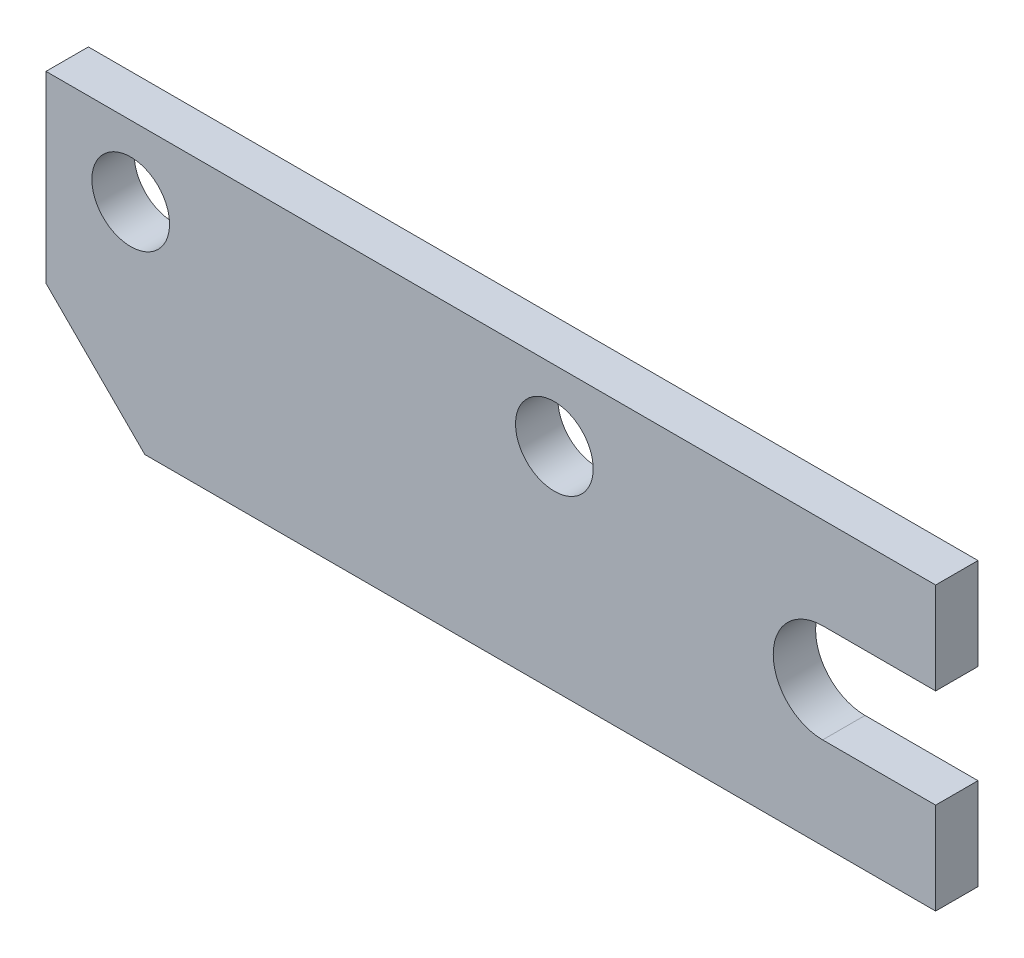
ISO-10303-21;
HEADER;
FILE_DESCRIPTION(('STEP AP214'),'2;1');
FILE_NAME('part.step','',(''),(''),'','','');
FILE_SCHEMA(('AUTOMOTIVE_DESIGN { 1 0 10303 214 1 1 1 1 }'));
ENDSEC;
DATA;
#1=APPLICATION_CONTEXT('core data for automotive mechanical design processes');
#2=APPLICATION_PROTOCOL_DEFINITION('international standard','automotive_design',2000,#1);
#3=PRODUCT_CONTEXT('',#1,'mechanical');
#4=PRODUCT('Part','Part','',(#3));
#5=PRODUCT_RELATED_PRODUCT_CATEGORY('part','',(#4));
#6=PRODUCT_DEFINITION_FORMATION('','',#4);
#7=PRODUCT_DEFINITION_CONTEXT('part definition',#1,'design');
#8=PRODUCT_DEFINITION('design','',#6,#7);
#9=PRODUCT_DEFINITION_SHAPE('','',#8);
#10=(LENGTH_UNIT() NAMED_UNIT(*) SI_UNIT(.MILLI.,.METRE.));
#11=(NAMED_UNIT(*) PLANE_ANGLE_UNIT() SI_UNIT($,.RADIAN.));
#12=(NAMED_UNIT(*) SI_UNIT($,.STERADIAN.) SOLID_ANGLE_UNIT());
#13=UNCERTAINTY_MEASURE_WITH_UNIT(LENGTH_MEASURE(1.E-05),#10,'distance_accuracy_value','');
#14=(GEOMETRIC_REPRESENTATION_CONTEXT(3) GLOBAL_UNCERTAINTY_ASSIGNED_CONTEXT((#13)) GLOBAL_UNIT_ASSIGNED_CONTEXT((#10,
#11,#12)) REPRESENTATION_CONTEXT('',''));
#15=CARTESIAN_POINT('',(0.,0.,0.));
#16=DIRECTION('',(0.,0.,1.));
#17=DIRECTION('',(1.,0.,0.));
#18=AXIS2_PLACEMENT_3D('',#15,#16,#17);
#19=CARTESIAN_POINT('',(31.5,-10.,3.));
#20=DIRECTION('',(-1.,0.,0.));
#21=DIRECTION('',(0.,0.,1.));
#22=AXIS2_PLACEMENT_3D('',#19,#20,#21);
#23=PLANE('',#22);
#24=DIRECTION('',(0.,1.,0.));
#25=VECTOR('',#24,1.);
#26=CARTESIAN_POINT('',(31.5,-10.,3.));
#27=LINE('',#26,#25);
#28=CARTESIAN_POINT('',(31.5,3.5,3.));
#29=VERTEX_POINT('',#28);
#30=CARTESIAN_POINT('',(31.5,10.,3.));
#31=VERTEX_POINT('',#30);
#32=EDGE_CURVE('E134',#29,#31,#27,.T.);
#33=ORIENTED_EDGE('',*,*,#32,.F.);
#34=DIRECTION('',(0.,0.,-1.));
#35=VECTOR('',#34,1.);
#36=CARTESIAN_POINT('',(31.5,3.5,3.));
#37=LINE('',#36,#35);
#38=CARTESIAN_POINT('',(31.5,3.5,0.));
#39=VERTEX_POINT('',#38);
#40=EDGE_CURVE('E181',#29,#39,#37,.T.);
#41=ORIENTED_EDGE('',*,*,#40,.T.);
#42=DIRECTION('',(0.,1.,0.));
#43=VECTOR('',#42,1.);
#44=CARTESIAN_POINT('',(31.5,-10.,0.));
#45=LINE('',#44,#43);
#46=CARTESIAN_POINT('',(31.5,10.,0.));
#47=VERTEX_POINT('',#46);
#48=EDGE_CURVE('E148',#39,#47,#45,.T.);
#49=ORIENTED_EDGE('',*,*,#48,.T.);
#50=DIRECTION('',(0.,0.,-1.));
#51=VECTOR('',#50,1.);
#52=CARTESIAN_POINT('',(31.5,10.,3.));
#53=LINE('',#52,#51);
#54=EDGE_CURVE('E157',#31,#47,#53,.T.);
#55=ORIENTED_EDGE('',*,*,#54,.F.);
#56=EDGE_LOOP('',(#33,#41,#49,#55));
#57=FACE_BOUND('',#56,.T.);
#58=ADVANCED_FACE('F35',(#57),#23,.F.);
#59=CARTESIAN_POINT('',(31.5,-10.,0.));
#60=VERTEX_POINT('',#59);
#61=CARTESIAN_POINT('',(31.5,-3.5,0.));
#62=VERTEX_POINT('',#61);
#63=EDGE_CURVE('E126',#60,#62,#45,.T.);
#64=ORIENTED_EDGE('',*,*,#63,.T.);
#65=DIRECTION('',(0.,0.,-1.));
#66=VECTOR('',#65,1.);
#67=CARTESIAN_POINT('',(31.5,-3.5,3.));
#68=LINE('',#67,#66);
#69=CARTESIAN_POINT('',(31.5,-3.5,3.));
#70=VERTEX_POINT('',#69);
#71=EDGE_CURVE('E109',#70,#62,#68,.T.);
#72=ORIENTED_EDGE('',*,*,#71,.F.);
#73=CARTESIAN_POINT('',(31.5,-10.,3.));
#74=VERTEX_POINT('',#73);
#75=EDGE_CURVE('E124',#74,#70,#27,.T.);
#76=ORIENTED_EDGE('',*,*,#75,.F.);
#77=DIRECTION('',(0.,0.,-1.));
#78=VECTOR('',#77,1.);
#79=CARTESIAN_POINT('',(31.5,-10.,3.));
#80=LINE('',#79,#78);
#81=EDGE_CURVE('E145',#74,#60,#80,.T.);
#82=ORIENTED_EDGE('',*,*,#81,.T.);
#83=EDGE_LOOP('',(#64,#72,#76,#82));
#84=FACE_BOUND('',#83,.T.);
#85=ADVANCED_FACE('F122',(#84),#23,.F.);
#86=CARTESIAN_POINT('',(-31.5,10.,3.));
#87=DIRECTION('',(0.,-1.,0.));
#88=DIRECTION('',(0.,0.,-1.));
#89=AXIS2_PLACEMENT_3D('',#86,#87,#88);
#90=PLANE('',#89);
#91=DIRECTION('',(-1.,0.,0.));
#92=VECTOR('',#91,1.);
#93=CARTESIAN_POINT('',(-31.5,10.,0.));
#94=LINE('',#93,#92);
#95=CARTESIAN_POINT('',(-31.5,10.,0.));
#96=VERTEX_POINT('',#95);
#97=EDGE_CURVE('E147',#47,#96,#94,.T.);
#98=ORIENTED_EDGE('',*,*,#97,.T.);
#99=DIRECTION('',(0.,0.,-1.));
#100=VECTOR('',#99,1.);
#101=CARTESIAN_POINT('',(-31.5,10.,3.));
#102=LINE('',#101,#100);
#103=CARTESIAN_POINT('',(-31.5,10.,3.));
#104=VERTEX_POINT('',#103);
#105=EDGE_CURVE('E154',#104,#96,#102,.T.);
#106=ORIENTED_EDGE('',*,*,#105,.F.);
#107=DIRECTION('',(-1.,0.,0.));
#108=VECTOR('',#107,1.);
#109=CARTESIAN_POINT('',(-31.5,10.,3.));
#110=LINE('',#109,#108);
#111=EDGE_CURVE('E133',#31,#104,#110,.T.);
#112=ORIENTED_EDGE('',*,*,#111,.F.);
#113=ORIENTED_EDGE('',*,*,#54,.T.);
#114=EDGE_LOOP('',(#98,#106,#112,#113));
#115=FACE_BOUND('',#114,.T.);
#116=ADVANCED_FACE('F207',(#115),#90,.F.);
#117=CARTESIAN_POINT('',(-31.5,-10.,3.));
#118=DIRECTION('',(1.,0.,0.));
#119=DIRECTION('',(0.,0.,-1.));
#120=AXIS2_PLACEMENT_3D('',#117,#118,#119);
#121=PLANE('',#120);
#122=DIRECTION('',(0.,-1.,0.));
#123=VECTOR('',#122,1.);
#124=CARTESIAN_POINT('',(-31.5,-10.,0.));
#125=LINE('',#124,#123);
#126=CARTESIAN_POINT('',(-31.5,-2.99999999999996,0.));
#127=VERTEX_POINT('',#126);
#128=EDGE_CURVE('E150',#96,#127,#125,.T.);
#129=ORIENTED_EDGE('',*,*,#128,.T.);
#130=DIRECTION('',(0.,0.,1.));
#131=VECTOR('',#130,1.);
#132=CARTESIAN_POINT('',(-31.5,-2.99999999999996,3.));
#133=LINE('',#132,#131);
#134=CARTESIAN_POINT('',(-31.5,-2.99999999999996,3.));
#135=VERTEX_POINT('',#134);
#136=EDGE_CURVE('E43',#127,#135,#133,.T.);
#137=ORIENTED_EDGE('',*,*,#136,.T.);
#138=DIRECTION('',(0.,-1.,0.));
#139=VECTOR('',#138,1.);
#140=CARTESIAN_POINT('',(-31.5,-10.,3.));
#141=LINE('',#140,#139);
#142=EDGE_CURVE('E136',#104,#135,#141,.T.);
#143=ORIENTED_EDGE('',*,*,#142,.F.);
#144=ORIENTED_EDGE('',*,*,#105,.T.);
#145=EDGE_LOOP('',(#129,#137,#143,#144));
#146=FACE_BOUND('',#145,.T.);
#147=ADVANCED_FACE('F230',(#146),#121,.F.);
#148=CARTESIAN_POINT('',(-31.5,-10.,3.));
#149=DIRECTION('',(0.,1.,0.));
#150=DIRECTION('',(0.,0.,1.));
#151=AXIS2_PLACEMENT_3D('',#148,#149,#150);
#152=PLANE('',#151);
#153=DIRECTION('',(1.,0.,0.));
#154=VECTOR('',#153,1.);
#155=CARTESIAN_POINT('',(-31.5,-10.,3.));
#156=LINE('',#155,#154);
#157=CARTESIAN_POINT('',(-24.5,-10.,3.));
#158=VERTEX_POINT('',#157);
#159=EDGE_CURVE('E131',#158,#74,#156,.T.);
#160=ORIENTED_EDGE('',*,*,#159,.F.);
#161=DIRECTION('',(0.,0.,-1.));
#162=VECTOR('',#161,1.);
#163=CARTESIAN_POINT('',(-24.5,-10.,3.));
#164=LINE('',#163,#162);
#165=CARTESIAN_POINT('',(-24.5,-10.,0.));
#166=VERTEX_POINT('',#165);
#167=EDGE_CURVE('E160',#158,#166,#164,.T.);
#168=ORIENTED_EDGE('',*,*,#167,.T.);
#169=DIRECTION('',(1.,0.,0.));
#170=VECTOR('',#169,1.);
#171=CARTESIAN_POINT('',(-31.5,-10.,0.));
#172=LINE('',#171,#170);
#173=EDGE_CURVE('E138',#166,#60,#172,.T.);
#174=ORIENTED_EDGE('',*,*,#173,.T.);
#175=ORIENTED_EDGE('',*,*,#81,.F.);
#176=EDGE_LOOP('',(#160,#168,#174,#175));
#177=FACE_BOUND('',#176,.T.);
#178=ADVANCED_FACE('F165',(#177),#152,.F.);
#179=CARTESIAN_POINT('',(0.,0.,3.));
#180=DIRECTION('',(0.,0.,-1.));
#181=DIRECTION('',(-1.,0.,0.));
#182=AXIS2_PLACEMENT_3D('',#179,#180,#181);
#183=PLANE('',#182);
#184=CARTESIAN_POINT('',(-25.5,5.,3.));
#185=DIRECTION('',(0.,0.,-1.));
#186=DIRECTION('',(-1.,0.,0.));
#187=AXIS2_PLACEMENT_3D('',#184,#185,#186);
#188=CIRCLE('',#187,2.75);
#189=CARTESIAN_POINT('',(-28.25,5.,3.));
#190=VERTEX_POINT('',#189);
#191=EDGE_CURVE('E190',#190,#190,#188,.T.);
#192=ORIENTED_EDGE('',*,*,#191,.T.);
#193=EDGE_LOOP('',(#192));
#194=FACE_BOUND('',#193,.T.);
#195=CARTESIAN_POINT('',(4.49999999999999,5.,3.));
#196=DIRECTION('',(0.,0.,-1.));
#197=DIRECTION('',(-1.,0.,0.));
#198=AXIS2_PLACEMENT_3D('',#195,#196,#197);
#199=CIRCLE('',#198,2.75);
#200=CARTESIAN_POINT('',(1.74999999999999,5.,3.));
#201=VERTEX_POINT('',#200);
#202=EDGE_CURVE('E140',#201,#201,#199,.T.);
#203=ORIENTED_EDGE('',*,*,#202,.T.);
#204=EDGE_LOOP('',(#203));
#205=FACE_BOUND('',#204,.T.);
#206=ORIENTED_EDGE('',*,*,#142,.T.);
#207=DIRECTION('',(-0.707106781186546,0.707106781186549,0.));
#208=VECTOR('',#207,1.);
#209=CARTESIAN_POINT('',(-24.5,-10.,3.));
#210=LINE('',#209,#208);
#211=EDGE_CURVE('E11',#135,#158,#210,.F.);
#212=ORIENTED_EDGE('',*,*,#211,.T.);
#213=ORIENTED_EDGE('',*,*,#159,.T.);
#214=ORIENTED_EDGE('',*,*,#75,.T.);
#215=DIRECTION('',(-1.,0.,0.));
#216=VECTOR('',#215,1.);
#217=CARTESIAN_POINT('',(23.5,-3.5,3.));
#218=LINE('',#217,#216);
#219=CARTESIAN_POINT('',(23.5,-3.5,3.));
#220=VERTEX_POINT('',#219);
#221=EDGE_CURVE('E105',#70,#220,#218,.T.);
#222=ORIENTED_EDGE('',*,*,#221,.T.);
#223=CARTESIAN_POINT('',(23.5,0.,3.));
#224=DIRECTION('',(0.,0.,-1.));
#225=DIRECTION('',(1.,0.,0.));
#226=AXIS2_PLACEMENT_3D('',#223,#224,#225);
#227=CIRCLE('',#226,3.5);
#228=CARTESIAN_POINT('',(23.5,3.5,3.));
#229=VERTEX_POINT('',#228);
#230=EDGE_CURVE('E116',#220,#229,#227,.T.);
#231=ORIENTED_EDGE('',*,*,#230,.T.);
#232=DIRECTION('',(1.,0.,0.));
#233=VECTOR('',#232,1.);
#234=CARTESIAN_POINT('',(23.5,3.5,3.));
#235=LINE('',#234,#233);
#236=EDGE_CURVE('E127',#229,#29,#235,.T.);
#237=ORIENTED_EDGE('',*,*,#236,.T.);
#238=ORIENTED_EDGE('',*,*,#32,.T.);
#239=ORIENTED_EDGE('',*,*,#111,.T.);
#240=EDGE_LOOP('',(#206,#212,#213,#214,#222,#231,#237,#238,#239));
#241=FACE_BOUND('',#240,.T.);
#242=ADVANCED_FACE('F129',(#194,#205,#241),#183,.F.);
#243=CARTESIAN_POINT('',(0.,0.,0.));
#244=DIRECTION('',(0.,0.,-1.));
#245=DIRECTION('',(-1.,0.,0.));
#246=AXIS2_PLACEMENT_3D('',#243,#244,#245);
#247=PLANE('',#246);
#248=ORIENTED_EDGE('',*,*,#173,.F.);
#249=DIRECTION('',(0.707106781186546,-0.707106781186549,0.));
#250=VECTOR('',#249,1.);
#251=CARTESIAN_POINT('',(-17.2500000000001,-17.25,0.));
#252=LINE('',#251,#250);
#253=EDGE_CURVE('E57',#166,#127,#252,.F.);
#254=ORIENTED_EDGE('',*,*,#253,.T.);
#255=ORIENTED_EDGE('',*,*,#128,.F.);
#256=ORIENTED_EDGE('',*,*,#97,.F.);
#257=ORIENTED_EDGE('',*,*,#48,.F.);
#258=DIRECTION('',(1.,0.,0.));
#259=VECTOR('',#258,1.);
#260=CARTESIAN_POINT('',(23.5,3.5,0.));
#261=LINE('',#260,#259);
#262=CARTESIAN_POINT('',(23.5,3.5,0.));
#263=VERTEX_POINT('',#262);
#264=EDGE_CURVE('E117',#263,#39,#261,.T.);
#265=ORIENTED_EDGE('',*,*,#264,.F.);
#266=CARTESIAN_POINT('',(23.5,0.,0.));
#267=DIRECTION('',(0.,0.,-1.));
#268=DIRECTION('',(1.,0.,0.));
#269=AXIS2_PLACEMENT_3D('',#266,#267,#268);
#270=CIRCLE('',#269,3.5);
#271=CARTESIAN_POINT('',(23.5,-3.5,0.));
#272=VERTEX_POINT('',#271);
#273=EDGE_CURVE('E174',#272,#263,#270,.T.);
#274=ORIENTED_EDGE('',*,*,#273,.F.);
#275=DIRECTION('',(-1.,0.,0.));
#276=VECTOR('',#275,1.);
#277=CARTESIAN_POINT('',(23.5,-3.5,0.));
#278=LINE('',#277,#276);
#279=EDGE_CURVE('E171',#62,#272,#278,.T.);
#280=ORIENTED_EDGE('',*,*,#279,.F.);
#281=ORIENTED_EDGE('',*,*,#63,.F.);
#282=EDGE_LOOP('',(#248,#254,#255,#256,#257,#265,#274,#280,#281));
#283=FACE_BOUND('',#282,.T.);
#284=CARTESIAN_POINT('',(-25.5,5.,0.));
#285=DIRECTION('',(0.,0.,-1.));
#286=DIRECTION('',(-1.,0.,0.));
#287=AXIS2_PLACEMENT_3D('',#284,#285,#286);
#288=CIRCLE('',#287,2.74999999999999);
#289=CARTESIAN_POINT('',(-28.25,5.,0.));
#290=VERTEX_POINT('',#289);
#291=EDGE_CURVE('E184',#290,#290,#288,.T.);
#292=ORIENTED_EDGE('',*,*,#291,.F.);
#293=EDGE_LOOP('',(#292));
#294=FACE_BOUND('',#293,.T.);
#295=CARTESIAN_POINT('',(4.49999999999999,5.,0.));
#296=DIRECTION('',(0.,0.,-1.));
#297=DIRECTION('',(-1.,0.,0.));
#298=AXIS2_PLACEMENT_3D('',#295,#296,#297);
#299=CIRCLE('',#298,2.74999999999999);
#300=CARTESIAN_POINT('',(1.75,5.,0.));
#301=VERTEX_POINT('',#300);
#302=EDGE_CURVE('E192',#301,#301,#299,.T.);
#303=ORIENTED_EDGE('',*,*,#302,.F.);
#304=EDGE_LOOP('',(#303));
#305=FACE_BOUND('',#304,.T.);
#306=ADVANCED_FACE('F168',(#283,#294,#305),#247,.T.);
#307=CARTESIAN_POINT('',(4.49999999999999,5.,0.));
#308=DIRECTION('',(0.,0.,-1.));
#309=DIRECTION('',(-1.,0.,0.));
#310=AXIS2_PLACEMENT_3D('',#307,#308,#309);
#311=CYLINDRICAL_SURFACE('',#310,2.74999999999999);
#312=ORIENTED_EDGE('',*,*,#202,.F.);
#313=EDGE_LOOP('',(#312));
#314=FACE_BOUND('',#313,.T.);
#315=ORIENTED_EDGE('',*,*,#302,.T.);
#316=EDGE_LOOP('',(#315));
#317=FACE_BOUND('',#316,.T.);
#318=ADVANCED_FACE('F237',(#314,#317),#311,.F.);
#319=CARTESIAN_POINT('',(-25.5,5.,0.));
#320=DIRECTION('',(0.,0.,-1.));
#321=DIRECTION('',(-1.,0.,0.));
#322=AXIS2_PLACEMENT_3D('',#319,#320,#321);
#323=CYLINDRICAL_SURFACE('',#322,2.74999999999999);
#324=ORIENTED_EDGE('',*,*,#191,.F.);
#325=EDGE_LOOP('',(#324));
#326=FACE_BOUND('',#325,.T.);
#327=ORIENTED_EDGE('',*,*,#291,.T.);
#328=EDGE_LOOP('',(#327));
#329=FACE_BOUND('',#328,.T.);
#330=ADVANCED_FACE('F221',(#326,#329),#323,.F.);
#331=CARTESIAN_POINT('',(23.5,3.5,3.));
#332=DIRECTION('',(0.,1.,0.));
#333=DIRECTION('',(-1.,0.,0.));
#334=AXIS2_PLACEMENT_3D('',#331,#332,#333);
#335=PLANE('',#334);
#336=ORIENTED_EDGE('',*,*,#264,.T.);
#337=ORIENTED_EDGE('',*,*,#40,.F.);
#338=ORIENTED_EDGE('',*,*,#236,.F.);
#339=DIRECTION('',(0.,0.,-1.));
#340=VECTOR('',#339,1.);
#341=CARTESIAN_POINT('',(23.5,3.5,3.));
#342=LINE('',#341,#340);
#343=EDGE_CURVE('E185',#229,#263,#342,.T.);
#344=ORIENTED_EDGE('',*,*,#343,.T.);
#345=EDGE_LOOP('',(#336,#337,#338,#344));
#346=FACE_BOUND('',#345,.T.);
#347=ADVANCED_FACE('F211',(#346),#335,.F.);
#348=CARTESIAN_POINT('',(23.5,0.,3.));
#349=DIRECTION('',(0.,0.,-1.));
#350=DIRECTION('',(-1.,0.,0.));
#351=AXIS2_PLACEMENT_3D('',#348,#349,#350);
#352=CYLINDRICAL_SURFACE('',#351,3.5);
#353=ORIENTED_EDGE('',*,*,#273,.T.);
#354=ORIENTED_EDGE('',*,*,#343,.F.);
#355=ORIENTED_EDGE('',*,*,#230,.F.);
#356=DIRECTION('',(0.,0.,-1.));
#357=VECTOR('',#356,1.);
#358=CARTESIAN_POINT('',(23.5,-3.5,3.));
#359=LINE('',#358,#357);
#360=EDGE_CURVE('E111',#220,#272,#359,.T.);
#361=ORIENTED_EDGE('',*,*,#360,.T.);
#362=EDGE_LOOP('',(#353,#354,#355,#361));
#363=FACE_BOUND('',#362,.T.);
#364=ADVANCED_FACE('F213',(#363),#352,.F.);
#365=CARTESIAN_POINT('',(23.5,-3.5,3.));
#366=DIRECTION('',(0.,-1.,0.));
#367=DIRECTION('',(1.,0.,0.));
#368=AXIS2_PLACEMENT_3D('',#365,#366,#367);
#369=PLANE('',#368);
#370=ORIENTED_EDGE('',*,*,#279,.T.);
#371=ORIENTED_EDGE('',*,*,#360,.F.);
#372=ORIENTED_EDGE('',*,*,#221,.F.);
#373=ORIENTED_EDGE('',*,*,#71,.T.);
#374=EDGE_LOOP('',(#370,#371,#372,#373));
#375=FACE_BOUND('',#374,.T.);
#376=ADVANCED_FACE('F108',(#375),#369,.F.);
#377=CARTESIAN_POINT('',(-24.5,-10.,3.));
#378=DIRECTION('',(0.707106781186549,0.707106781186546,0.));
#379=DIRECTION('',(0.,0.,-1.));
#380=AXIS2_PLACEMENT_3D('',#377,#378,#379);
#381=PLANE('',#380);
#382=ORIENTED_EDGE('',*,*,#211,.F.);
#383=ORIENTED_EDGE('',*,*,#136,.F.);
#384=ORIENTED_EDGE('',*,*,#253,.F.);
#385=ORIENTED_EDGE('',*,*,#167,.F.);
#386=EDGE_LOOP('',(#382,#383,#384,#385));
#387=FACE_BOUND('',#386,.T.);
#388=ADVANCED_FACE('F37',(#387),#381,.F.);
#389=CLOSED_SHELL('',(#58,#85,#116,#147,#178,#242,#306,#318,#330,#347,#364,#376,#388));
#390=MANIFOLD_SOLID_BREP('B2',#389);
#391=ADVANCED_BREP_SHAPE_REPRESENTATION('',(#18,#390),#14);
#392=SHAPE_DEFINITION_REPRESENTATION(#9,#391);
ENDSEC;
END-ISO-10303-21;
